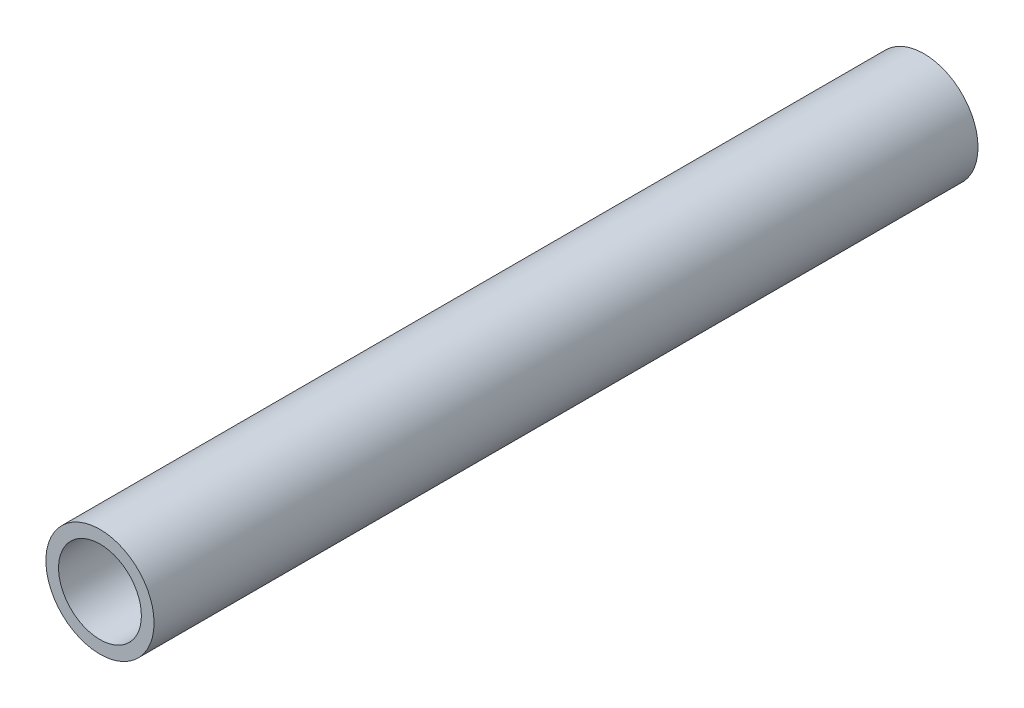
ISO-10303-21;
HEADER;
FILE_DESCRIPTION(('STEP AP214'),'2;1');
FILE_NAME('part.step','',(''),(''),'','','');
FILE_SCHEMA(('AUTOMOTIVE_DESIGN { 1 0 10303 214 1 1 1 1 }'));
ENDSEC;
DATA;
#1=APPLICATION_CONTEXT('core data for automotive mechanical design processes');
#2=APPLICATION_PROTOCOL_DEFINITION('international standard','automotive_design',2000,#1);
#3=PRODUCT_CONTEXT('',#1,'mechanical');
#4=PRODUCT('Part','Part','',(#3));
#5=PRODUCT_RELATED_PRODUCT_CATEGORY('part','',(#4));
#6=PRODUCT_DEFINITION_FORMATION('','',#4);
#7=PRODUCT_DEFINITION_CONTEXT('part definition',#1,'design');
#8=PRODUCT_DEFINITION('design','',#6,#7);
#9=PRODUCT_DEFINITION_SHAPE('','',#8);
#10=(LENGTH_UNIT() NAMED_UNIT(*) SI_UNIT(.MILLI.,.METRE.));
#11=(NAMED_UNIT(*) PLANE_ANGLE_UNIT() SI_UNIT($,.RADIAN.));
#12=(NAMED_UNIT(*) SI_UNIT($,.STERADIAN.) SOLID_ANGLE_UNIT());
#13=UNCERTAINTY_MEASURE_WITH_UNIT(LENGTH_MEASURE(1.E-05),#10,'distance_accuracy_value','');
#14=(GEOMETRIC_REPRESENTATION_CONTEXT(3) GLOBAL_UNCERTAINTY_ASSIGNED_CONTEXT((#13)) GLOBAL_UNIT_ASSIGNED_CONTEXT((#10,
#11,#12)) REPRESENTATION_CONTEXT('',''));
#15=CARTESIAN_POINT('',(0.,0.,0.));
#16=DIRECTION('',(0.,0.,1.));
#17=DIRECTION('',(1.,0.,0.));
#18=AXIS2_PLACEMENT_3D('',#15,#16,#17);
#19=CARTESIAN_POINT('',(0.,0.,101.6));
#20=DIRECTION('',(0.,0.,1.));
#21=DIRECTION('',(1.,0.,0.));
#22=AXIS2_PLACEMENT_3D('',#19,#20,#21);
#23=PLANE('',#22);
#24=CARTESIAN_POINT('',(0.,0.,101.6));
#25=DIRECTION('',(0.,0.,1.));
#26=DIRECTION('',(1.,0.,0.));
#27=AXIS2_PLACEMENT_3D('',#24,#25,#26);
#28=CIRCLE('',#27,13.335);
#29=CARTESIAN_POINT('',(13.335,0.,101.6));
#30=VERTEX_POINT('',#29);
#31=EDGE_CURVE('E10',#30,#30,#28,.T.);
#32=ORIENTED_EDGE('',*,*,#31,.T.);
#33=EDGE_LOOP('',(#32));
#34=FACE_BOUND('',#33,.T.);
#35=CARTESIAN_POINT('',(0.,0.,101.6));
#36=DIRECTION('',(0.,0.,1.));
#37=DIRECTION('',(1.,0.,0.));
#38=AXIS2_PLACEMENT_3D('',#35,#36,#37);
#39=CIRCLE('',#38,10.2108);
#40=CARTESIAN_POINT('',(10.2108,0.,101.6));
#41=VERTEX_POINT('',#40);
#42=EDGE_CURVE('E42',#41,#41,#39,.T.);
#43=ORIENTED_EDGE('',*,*,#42,.F.);
#44=EDGE_LOOP('',(#43));
#45=FACE_BOUND('',#44,.T.);
#46=ADVANCED_FACE('F31',(#34,#45),#23,.T.);
#47=CARTESIAN_POINT('',(0.,0.,-101.6));
#48=DIRECTION('',(0.,0.,1.));
#49=DIRECTION('',(1.,0.,0.));
#50=AXIS2_PLACEMENT_3D('',#47,#48,#49);
#51=PLANE('',#50);
#52=CARTESIAN_POINT('',(0.,0.,-101.6));
#53=DIRECTION('',(0.,0.,1.));
#54=DIRECTION('',(1.,0.,0.));
#55=AXIS2_PLACEMENT_3D('',#52,#53,#54);
#56=CIRCLE('',#55,13.335);
#57=CARTESIAN_POINT('',(13.335,0.,-101.6));
#58=VERTEX_POINT('',#57);
#59=EDGE_CURVE('E35',#58,#58,#56,.T.);
#60=ORIENTED_EDGE('',*,*,#59,.F.);
#61=EDGE_LOOP('',(#60));
#62=FACE_BOUND('',#61,.T.);
#63=CARTESIAN_POINT('',(0.,0.,-101.6));
#64=DIRECTION('',(0.,0.,1.));
#65=DIRECTION('',(1.,0.,0.));
#66=AXIS2_PLACEMENT_3D('',#63,#64,#65);
#67=CIRCLE('',#66,10.2108);
#68=CARTESIAN_POINT('',(10.2108,0.,-101.6));
#69=VERTEX_POINT('',#68);
#70=EDGE_CURVE('E44',#69,#69,#67,.T.);
#71=ORIENTED_EDGE('',*,*,#70,.T.);
#72=EDGE_LOOP('',(#71));
#73=FACE_BOUND('',#72,.T.);
#74=ADVANCED_FACE('F54',(#62,#73),#51,.F.);
#75=CARTESIAN_POINT('',(0.,0.,101.6));
#76=DIRECTION('',(0.,0.,-1.));
#77=DIRECTION('',(-1.,0.,0.));
#78=AXIS2_PLACEMENT_3D('',#75,#76,#77);
#79=CYLINDRICAL_SURFACE('',#78,13.335);
#80=ORIENTED_EDGE('',*,*,#31,.F.);
#81=EDGE_LOOP('',(#80));
#82=FACE_BOUND('',#81,.T.);
#83=ORIENTED_EDGE('',*,*,#59,.T.);
#84=EDGE_LOOP('',(#83));
#85=FACE_BOUND('',#84,.T.);
#86=ADVANCED_FACE('F33',(#82,#85),#79,.T.);
#87=CARTESIAN_POINT('',(0.,0.,101.6));
#88=DIRECTION('',(0.,0.,-1.));
#89=DIRECTION('',(-1.,0.,0.));
#90=AXIS2_PLACEMENT_3D('',#87,#88,#89);
#91=CYLINDRICAL_SURFACE('',#90,10.2108);
#92=ORIENTED_EDGE('',*,*,#42,.T.);
#93=EDGE_LOOP('',(#92));
#94=FACE_BOUND('',#93,.T.);
#95=ORIENTED_EDGE('',*,*,#70,.F.);
#96=EDGE_LOOP('',(#95));
#97=FACE_BOUND('',#96,.T.);
#98=ADVANCED_FACE('F50',(#94,#97),#91,.F.);
#99=CLOSED_SHELL('',(#46,#74,#86,#98));
#100=MANIFOLD_SOLID_BREP('B2',#99);
#101=ADVANCED_BREP_SHAPE_REPRESENTATION('',(#18,#100),#14);
#102=SHAPE_DEFINITION_REPRESENTATION(#9,#101);
ENDSEC;
END-ISO-10303-21;
